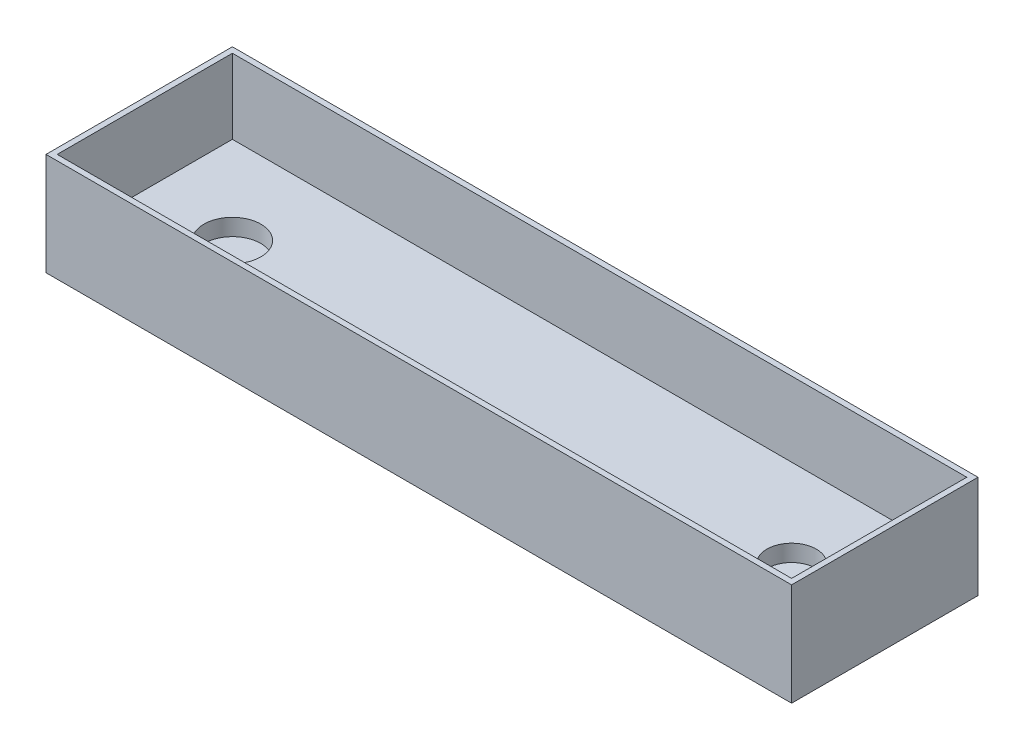
ISO-10303-21;
HEADER;
FILE_DESCRIPTION(('STEP AP214'),'2;1');
FILE_NAME('part.step','',(''),(''),'','','');
FILE_SCHEMA(('AUTOMOTIVE_DESIGN { 1 0 10303 214 1 1 1 1 }'));
ENDSEC;
DATA;
#1=APPLICATION_CONTEXT('core data for automotive mechanical design processes');
#2=APPLICATION_PROTOCOL_DEFINITION('international standard','automotive_design',2000,#1);
#3=PRODUCT_CONTEXT('',#1,'mechanical');
#4=PRODUCT('Part','Part','',(#3));
#5=PRODUCT_RELATED_PRODUCT_CATEGORY('part','',(#4));
#6=PRODUCT_DEFINITION_FORMATION('','',#4);
#7=PRODUCT_DEFINITION_CONTEXT('part definition',#1,'design');
#8=PRODUCT_DEFINITION('design','',#6,#7);
#9=PRODUCT_DEFINITION_SHAPE('','',#8);
#10=(LENGTH_UNIT() NAMED_UNIT(*) SI_UNIT(.MILLI.,.METRE.));
#11=(NAMED_UNIT(*) PLANE_ANGLE_UNIT() SI_UNIT($,.RADIAN.));
#12=(NAMED_UNIT(*) SI_UNIT($,.STERADIAN.) SOLID_ANGLE_UNIT());
#13=UNCERTAINTY_MEASURE_WITH_UNIT(LENGTH_MEASURE(1.E-05),#10,'distance_accuracy_value','');
#14=(GEOMETRIC_REPRESENTATION_CONTEXT(3) GLOBAL_UNCERTAINTY_ASSIGNED_CONTEXT((#13)) GLOBAL_UNIT_ASSIGNED_CONTEXT((#10,
#11,#12)) REPRESENTATION_CONTEXT('',''));
#15=CARTESIAN_POINT('',(0.,0.,0.));
#16=DIRECTION('',(0.,0.,1.));
#17=DIRECTION('',(1.,0.,0.));
#18=AXIS2_PLACEMENT_3D('',#15,#16,#17);
#19=CARTESIAN_POINT('',(0.,15.,0.));
#20=DIRECTION('',(0.,1.,0.));
#21=DIRECTION('',(0.,0.,1.));
#22=AXIS2_PLACEMENT_3D('',#19,#20,#21);
#23=PLANE('',#22);
#24=DIRECTION('',(0.,0.,-1.));
#25=VECTOR('',#24,1.);
#26=CARTESIAN_POINT('',(197.,15.,47.));
#27=LINE('',#26,#25);
#28=CARTESIAN_POINT('',(197.,15.,47.));
#29=VERTEX_POINT('',#28);
#30=CARTESIAN_POINT('',(197.,15.,-47.));
#31=VERTEX_POINT('',#30);
#32=EDGE_CURVE('E61',#29,#31,#27,.T.);
#33=ORIENTED_EDGE('',*,*,#32,.T.);
#34=DIRECTION('',(-1.,0.,0.));
#35=VECTOR('',#34,1.);
#36=CARTESIAN_POINT('',(-197.,15.,-47.));
#37=LINE('',#36,#35);
#38=CARTESIAN_POINT('',(-197.,15.,-47.));
#39=VERTEX_POINT('',#38);
#40=EDGE_CURVE('E65',#31,#39,#37,.T.);
#41=ORIENTED_EDGE('',*,*,#40,.T.);
#42=DIRECTION('',(0.,0.,1.));
#43=VECTOR('',#42,1.);
#44=CARTESIAN_POINT('',(-197.,15.,47.));
#45=LINE('',#44,#43);
#46=CARTESIAN_POINT('',(-197.,15.,47.));
#47=VERTEX_POINT('',#46);
#48=EDGE_CURVE('E146',#39,#47,#45,.T.);
#49=ORIENTED_EDGE('',*,*,#48,.T.);
#50=DIRECTION('',(1.,0.,0.));
#51=VECTOR('',#50,1.);
#52=CARTESIAN_POINT('',(-197.,15.,47.));
#53=LINE('',#52,#51);
#54=EDGE_CURVE('E121',#47,#29,#53,.T.);
#55=ORIENTED_EDGE('',*,*,#54,.T.);
#56=EDGE_LOOP('',(#33,#41,#49,#55));
#57=FACE_BOUND('',#56,.T.);
#58=CARTESIAN_POINT('',(-150.,15.,0.));
#59=DIRECTION('',(0.,1.,0.));
#60=DIRECTION('',(0.,0.,1.));
#61=AXIS2_PLACEMENT_3D('',#58,#59,#60);
#62=CIRCLE('',#61,15.25);
#63=CARTESIAN_POINT('',(-150.,15.,15.25));
#64=VERTEX_POINT('',#63);
#65=EDGE_CURVE('E180',#64,#64,#62,.T.);
#66=ORIENTED_EDGE('',*,*,#65,.F.);
#67=EDGE_LOOP('',(#66));
#68=FACE_BOUND('',#67,.T.);
#69=CARTESIAN_POINT('',(150.,15.,0.));
#70=DIRECTION('',(0.,1.,0.));
#71=DIRECTION('',(0.,0.,1.));
#72=AXIS2_PLACEMENT_3D('',#69,#70,#71);
#73=CIRCLE('',#72,13.25);
#74=CARTESIAN_POINT('',(150.,15.,13.25));
#75=VERTEX_POINT('',#74);
#76=EDGE_CURVE('E184',#75,#75,#73,.T.);
#77=ORIENTED_EDGE('',*,*,#76,.F.);
#78=EDGE_LOOP('',(#77));
#79=FACE_BOUND('',#78,.T.);
#80=ADVANCED_FACE('F45',(#57,#68,#79),#23,.T.);
#81=CARTESIAN_POINT('',(150.,6.,0.));
#82=DIRECTION('',(0.,1.,0.));
#83=DIRECTION('',(0.,0.,1.));
#84=AXIS2_PLACEMENT_3D('',#81,#82,#83);
#85=CYLINDRICAL_SURFACE('',#84,13.25);
#86=CARTESIAN_POINT('',(150.,6.,0.));
#87=DIRECTION('',(0.,1.,0.));
#88=DIRECTION('',(0.,0.,1.));
#89=AXIS2_PLACEMENT_3D('',#86,#87,#88);
#90=CIRCLE('',#89,13.25);
#91=CARTESIAN_POINT('',(150.,6.,13.25));
#92=VERTEX_POINT('',#91);
#93=EDGE_CURVE('E174',#92,#92,#90,.T.);
#94=ORIENTED_EDGE('',*,*,#93,.F.);
#95=EDGE_LOOP('',(#94));
#96=FACE_BOUND('',#95,.T.);
#97=ORIENTED_EDGE('',*,*,#76,.T.);
#98=EDGE_LOOP('',(#97));
#99=FACE_BOUND('',#98,.T.);
#100=ADVANCED_FACE('F236',(#96,#99),#85,.F.);
#101=CARTESIAN_POINT('',(150.,6.,0.));
#102=DIRECTION('',(0.,1.,0.));
#103=DIRECTION('',(0.,0.,1.));
#104=AXIS2_PLACEMENT_3D('',#101,#102,#103);
#105=PLANE('',#104);
#106=ORIENTED_EDGE('',*,*,#93,.T.);
#107=EDGE_LOOP('',(#106));
#108=FACE_BOUND('',#107,.T.);
#109=ADVANCED_FACE('F243',(#108),#105,.T.);
#110=CARTESIAN_POINT('',(-150.,6.,0.));
#111=DIRECTION('',(0.,1.,0.));
#112=DIRECTION('',(0.,0.,1.));
#113=AXIS2_PLACEMENT_3D('',#110,#111,#112);
#114=CYLINDRICAL_SURFACE('',#113,15.25);
#115=CARTESIAN_POINT('',(-150.,6.,0.));
#116=DIRECTION('',(0.,1.,0.));
#117=DIRECTION('',(0.,0.,1.));
#118=AXIS2_PLACEMENT_3D('',#115,#116,#117);
#119=CIRCLE('',#118,15.25);
#120=CARTESIAN_POINT('',(-150.,6.,15.25));
#121=VERTEX_POINT('',#120);
#122=EDGE_CURVE('E175',#121,#121,#119,.T.);
#123=ORIENTED_EDGE('',*,*,#122,.F.);
#124=EDGE_LOOP('',(#123));
#125=FACE_BOUND('',#124,.T.);
#126=ORIENTED_EDGE('',*,*,#65,.T.);
#127=EDGE_LOOP('',(#126));
#128=FACE_BOUND('',#127,.T.);
#129=ADVANCED_FACE('F310',(#125,#128),#114,.F.);
#130=CARTESIAN_POINT('',(-150.,6.,0.));
#131=DIRECTION('',(0.,1.,0.));
#132=DIRECTION('',(0.,0.,1.));
#133=AXIS2_PLACEMENT_3D('',#130,#131,#132);
#134=PLANE('',#133);
#135=ORIENTED_EDGE('',*,*,#122,.T.);
#136=EDGE_LOOP('',(#135));
#137=FACE_BOUND('',#136,.T.);
#138=ADVANCED_FACE('F318',(#137),#134,.T.);
#139=CARTESIAN_POINT('',(0.,55.,0.));
#140=DIRECTION('',(0.,1.,0.));
#141=DIRECTION('',(0.,0.,1.));
#142=AXIS2_PLACEMENT_3D('',#139,#140,#141);
#143=PLANE('',#142);
#144=DIRECTION('',(0.,0.,1.));
#145=VECTOR('',#144,1.);
#146=CARTESIAN_POINT('',(-200.,55.,-50.));
#147=LINE('',#146,#145);
#148=CARTESIAN_POINT('',(-200.,55.,-50.));
#149=VERTEX_POINT('',#148);
#150=CARTESIAN_POINT('',(-200.,55.,50.));
#151=VERTEX_POINT('',#150);
#152=EDGE_CURVE('E127',#149,#151,#147,.T.);
#153=ORIENTED_EDGE('',*,*,#152,.T.);
#154=DIRECTION('',(1.,0.,0.));
#155=VECTOR('',#154,1.);
#156=CARTESIAN_POINT('',(-200.,55.,50.));
#157=LINE('',#156,#155);
#158=CARTESIAN_POINT('',(200.,55.,50.));
#159=VERTEX_POINT('',#158);
#160=EDGE_CURVE('E162',#151,#159,#157,.T.);
#161=ORIENTED_EDGE('',*,*,#160,.T.);
#162=DIRECTION('',(0.,0.,-1.));
#163=VECTOR('',#162,1.);
#164=CARTESIAN_POINT('',(200.,55.,-50.));
#165=LINE('',#164,#163);
#166=CARTESIAN_POINT('',(200.,55.,-50.));
#167=VERTEX_POINT('',#166);
#168=EDGE_CURVE('E166',#159,#167,#165,.T.);
#169=ORIENTED_EDGE('',*,*,#168,.T.);
#170=DIRECTION('',(-1.,0.,0.));
#171=VECTOR('',#170,1.);
#172=CARTESIAN_POINT('',(-200.,55.,-50.));
#173=LINE('',#172,#171);
#174=EDGE_CURVE('E170',#167,#149,#173,.T.);
#175=ORIENTED_EDGE('',*,*,#174,.T.);
#176=EDGE_LOOP('',(#153,#161,#169,#175));
#177=FACE_BOUND('',#176,.T.);
#178=DIRECTION('',(-1.,0.,0.));
#179=VECTOR('',#178,1.);
#180=CARTESIAN_POINT('',(-197.,55.,-47.));
#181=LINE('',#180,#179);
#182=CARTESIAN_POINT('',(197.,55.,-47.));
#183=VERTEX_POINT('',#182);
#184=CARTESIAN_POINT('',(-197.,55.,-47.));
#185=VERTEX_POINT('',#184);
#186=EDGE_CURVE('E120',#183,#185,#181,.T.);
#187=ORIENTED_EDGE('',*,*,#186,.F.);
#188=DIRECTION('',(0.,0.,-1.));
#189=VECTOR('',#188,1.);
#190=CARTESIAN_POINT('',(197.,55.,47.));
#191=LINE('',#190,#189);
#192=CARTESIAN_POINT('',(197.,55.,47.));
#193=VERTEX_POINT('',#192);
#194=EDGE_CURVE('E110',#193,#183,#191,.T.);
#195=ORIENTED_EDGE('',*,*,#194,.F.);
#196=DIRECTION('',(1.,0.,0.));
#197=VECTOR('',#196,1.);
#198=CARTESIAN_POINT('',(-197.,55.,47.));
#199=LINE('',#198,#197);
#200=CARTESIAN_POINT('',(-197.,55.,47.));
#201=VERTEX_POINT('',#200);
#202=EDGE_CURVE('E137',#201,#193,#199,.T.);
#203=ORIENTED_EDGE('',*,*,#202,.F.);
#204=DIRECTION('',(0.,0.,1.));
#205=VECTOR('',#204,1.);
#206=CARTESIAN_POINT('',(-197.,55.,47.));
#207=LINE('',#206,#205);
#208=EDGE_CURVE('E133',#185,#201,#207,.T.);
#209=ORIENTED_EDGE('',*,*,#208,.F.);
#210=EDGE_LOOP('',(#187,#195,#203,#209));
#211=FACE_BOUND('',#210,.T.);
#212=ADVANCED_FACE('F131',(#177,#211),#143,.T.);
#213=CARTESIAN_POINT('',(197.,55.,47.));
#214=DIRECTION('',(-1.,0.,0.));
#215=DIRECTION('',(0.,0.,1.));
#216=AXIS2_PLACEMENT_3D('',#213,#214,#215);
#217=PLANE('',#216);
#218=ORIENTED_EDGE('',*,*,#32,.F.);
#219=DIRECTION('',(0.,-1.,0.));
#220=VECTOR('',#219,1.);
#221=CARTESIAN_POINT('',(197.,55.,47.));
#222=LINE('',#221,#220);
#223=EDGE_CURVE('E115',#193,#29,#222,.T.);
#224=ORIENTED_EDGE('',*,*,#223,.F.);
#225=ORIENTED_EDGE('',*,*,#194,.T.);
#226=DIRECTION('',(0.,-1.,0.));
#227=VECTOR('',#226,1.);
#228=CARTESIAN_POINT('',(197.,55.,-47.));
#229=LINE('',#228,#227);
#230=EDGE_CURVE('E113',#183,#31,#229,.T.);
#231=ORIENTED_EDGE('',*,*,#230,.T.);
#232=EDGE_LOOP('',(#218,#224,#225,#231));
#233=FACE_BOUND('',#232,.T.);
#234=ADVANCED_FACE('F112',(#233),#217,.T.);
#235=CARTESIAN_POINT('',(-197.,55.,-47.));
#236=DIRECTION('',(0.,0.,1.));
#237=DIRECTION('',(1.,0.,0.));
#238=AXIS2_PLACEMENT_3D('',#235,#236,#237);
#239=PLANE('',#238);
#240=ORIENTED_EDGE('',*,*,#40,.F.);
#241=ORIENTED_EDGE('',*,*,#230,.F.);
#242=ORIENTED_EDGE('',*,*,#186,.T.);
#243=DIRECTION('',(0.,-1.,0.));
#244=VECTOR('',#243,1.);
#245=CARTESIAN_POINT('',(-197.,55.,-47.));
#246=LINE('',#245,#244);
#247=EDGE_CURVE('E128',#185,#39,#246,.T.);
#248=ORIENTED_EDGE('',*,*,#247,.T.);
#249=EDGE_LOOP('',(#240,#241,#242,#248));
#250=FACE_BOUND('',#249,.T.);
#251=ADVANCED_FACE('F124',(#250),#239,.T.);
#252=CARTESIAN_POINT('',(-197.,55.,47.));
#253=DIRECTION('',(1.,0.,0.));
#254=DIRECTION('',(0.,0.,-1.));
#255=AXIS2_PLACEMENT_3D('',#252,#253,#254);
#256=PLANE('',#255);
#257=ORIENTED_EDGE('',*,*,#48,.F.);
#258=ORIENTED_EDGE('',*,*,#247,.F.);
#259=ORIENTED_EDGE('',*,*,#208,.T.);
#260=DIRECTION('',(0.,-1.,0.));
#261=VECTOR('',#260,1.);
#262=CARTESIAN_POINT('',(-197.,55.,47.));
#263=LINE('',#262,#261);
#264=EDGE_CURVE('E153',#201,#47,#263,.T.);
#265=ORIENTED_EDGE('',*,*,#264,.T.);
#266=EDGE_LOOP('',(#257,#258,#259,#265));
#267=FACE_BOUND('',#266,.T.);
#268=ADVANCED_FACE('F347',(#267),#256,.T.);
#269=CARTESIAN_POINT('',(-197.,55.,47.));
#270=DIRECTION('',(0.,0.,-1.));
#271=DIRECTION('',(-1.,0.,0.));
#272=AXIS2_PLACEMENT_3D('',#269,#270,#271);
#273=PLANE('',#272);
#274=ORIENTED_EDGE('',*,*,#54,.F.);
#275=ORIENTED_EDGE('',*,*,#264,.F.);
#276=ORIENTED_EDGE('',*,*,#202,.T.);
#277=ORIENTED_EDGE('',*,*,#223,.T.);
#278=EDGE_LOOP('',(#274,#275,#276,#277));
#279=FACE_BOUND('',#278,.T.);
#280=ADVANCED_FACE('F251',(#279),#273,.T.);
#281=CARTESIAN_POINT('',(0.,0.,0.));
#282=DIRECTION('',(0.,1.,0.));
#283=DIRECTION('',(0.,0.,1.));
#284=AXIS2_PLACEMENT_3D('',#281,#282,#283);
#285=PLANE('',#284);
#286=DIRECTION('',(0.,0.,1.));
#287=VECTOR('',#286,1.);
#288=CARTESIAN_POINT('',(-200.,0.,-50.));
#289=LINE('',#288,#287);
#290=CARTESIAN_POINT('',(-200.,0.,-50.));
#291=VERTEX_POINT('',#290);
#292=CARTESIAN_POINT('',(-200.,0.,50.));
#293=VERTEX_POINT('',#292);
#294=EDGE_CURVE('E179',#291,#293,#289,.T.);
#295=ORIENTED_EDGE('',*,*,#294,.F.);
#296=DIRECTION('',(-1.,0.,0.));
#297=VECTOR('',#296,1.);
#298=CARTESIAN_POINT('',(-200.,0.,-50.));
#299=LINE('',#298,#297);
#300=CARTESIAN_POINT('',(200.,0.,-50.));
#301=VERTEX_POINT('',#300);
#302=EDGE_CURVE('E200',#301,#291,#299,.T.);
#303=ORIENTED_EDGE('',*,*,#302,.F.);
#304=DIRECTION('',(0.,0.,-1.));
#305=VECTOR('',#304,1.);
#306=CARTESIAN_POINT('',(200.,0.,-50.));
#307=LINE('',#306,#305);
#308=CARTESIAN_POINT('',(200.,0.,50.));
#309=VERTEX_POINT('',#308);
#310=EDGE_CURVE('E197',#309,#301,#307,.T.);
#311=ORIENTED_EDGE('',*,*,#310,.F.);
#312=DIRECTION('',(1.,0.,0.));
#313=VECTOR('',#312,1.);
#314=CARTESIAN_POINT('',(-200.,0.,50.));
#315=LINE('',#314,#313);
#316=EDGE_CURVE('E194',#293,#309,#315,.T.);
#317=ORIENTED_EDGE('',*,*,#316,.F.);
#318=EDGE_LOOP('',(#295,#303,#311,#317));
#319=FACE_BOUND('',#318,.T.);
#320=ADVANCED_FACE('F221',(#319),#285,.F.);
#321=CARTESIAN_POINT('',(-200.,15.,-50.));
#322=DIRECTION('',(0.,0.,1.));
#323=DIRECTION('',(1.,0.,0.));
#324=AXIS2_PLACEMENT_3D('',#321,#322,#323);
#325=PLANE('',#324);
#326=ORIENTED_EDGE('',*,*,#302,.T.);
#327=DIRECTION('',(0.,-1.,0.));
#328=VECTOR('',#327,1.);
#329=CARTESIAN_POINT('',(-200.,15.,-50.));
#330=LINE('',#329,#328);
#331=EDGE_CURVE('E203',#149,#291,#330,.T.);
#332=ORIENTED_EDGE('',*,*,#331,.F.);
#333=ORIENTED_EDGE('',*,*,#174,.F.);
#334=DIRECTION('',(0.,-1.,0.));
#335=VECTOR('',#334,1.);
#336=CARTESIAN_POINT('',(200.,15.,-50.));
#337=LINE('',#336,#335);
#338=EDGE_CURVE('E207',#167,#301,#337,.T.);
#339=ORIENTED_EDGE('',*,*,#338,.T.);
#340=EDGE_LOOP('',(#326,#332,#333,#339));
#341=FACE_BOUND('',#340,.T.);
#342=ADVANCED_FACE('F223',(#341),#325,.F.);
#343=CARTESIAN_POINT('',(200.,15.,-50.));
#344=DIRECTION('',(-1.,0.,0.));
#345=DIRECTION('',(0.,0.,1.));
#346=AXIS2_PLACEMENT_3D('',#343,#344,#345);
#347=PLANE('',#346);
#348=ORIENTED_EDGE('',*,*,#310,.T.);
#349=ORIENTED_EDGE('',*,*,#338,.F.);
#350=ORIENTED_EDGE('',*,*,#168,.F.);
#351=DIRECTION('',(0.,-1.,0.));
#352=VECTOR('',#351,1.);
#353=CARTESIAN_POINT('',(200.,15.,50.));
#354=LINE('',#353,#352);
#355=EDGE_CURVE('E54',#159,#309,#354,.T.);
#356=ORIENTED_EDGE('',*,*,#355,.T.);
#357=EDGE_LOOP('',(#348,#349,#350,#356));
#358=FACE_BOUND('',#357,.T.);
#359=ADVANCED_FACE('F215',(#358),#347,.F.);
#360=CARTESIAN_POINT('',(-200.,15.,50.));
#361=DIRECTION('',(0.,0.,-1.));
#362=DIRECTION('',(-1.,0.,0.));
#363=AXIS2_PLACEMENT_3D('',#360,#361,#362);
#364=PLANE('',#363);
#365=ORIENTED_EDGE('',*,*,#316,.T.);
#366=ORIENTED_EDGE('',*,*,#355,.F.);
#367=ORIENTED_EDGE('',*,*,#160,.F.);
#368=DIRECTION('',(0.,-1.,0.));
#369=VECTOR('',#368,1.);
#370=CARTESIAN_POINT('',(-200.,15.,50.));
#371=LINE('',#370,#369);
#372=EDGE_CURVE('E11',#151,#293,#371,.T.);
#373=ORIENTED_EDGE('',*,*,#372,.T.);
#374=EDGE_LOOP('',(#365,#366,#367,#373));
#375=FACE_BOUND('',#374,.T.);
#376=ADVANCED_FACE('F228',(#375),#364,.F.);
#377=CARTESIAN_POINT('',(-200.,15.,-50.));
#378=DIRECTION('',(1.,0.,0.));
#379=DIRECTION('',(0.,0.,-1.));
#380=AXIS2_PLACEMENT_3D('',#377,#378,#379);
#381=PLANE('',#380);
#382=ORIENTED_EDGE('',*,*,#294,.T.);
#383=ORIENTED_EDGE('',*,*,#372,.F.);
#384=ORIENTED_EDGE('',*,*,#152,.F.);
#385=ORIENTED_EDGE('',*,*,#331,.T.);
#386=EDGE_LOOP('',(#382,#383,#384,#385));
#387=FACE_BOUND('',#386,.T.);
#388=ADVANCED_FACE('F47',(#387),#381,.F.);
#389=CLOSED_SHELL('',(#80,#100,#109,#129,#138,#212,#234,#251,#268,#280,#320,#342,#359,#376,#388));
#390=MANIFOLD_SOLID_BREP('B2',#389);
#391=ADVANCED_BREP_SHAPE_REPRESENTATION('',(#18,#390),#14);
#392=SHAPE_DEFINITION_REPRESENTATION(#9,#391);
ENDSEC;
END-ISO-10303-21;
